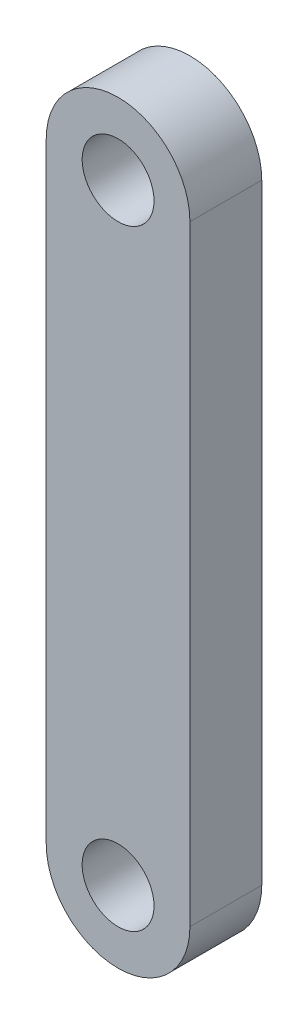
ISO-10303-21;
HEADER;
FILE_DESCRIPTION(('STEP AP214'),'2;1');
FILE_NAME('part.step','',(''),(''),'','','');
FILE_SCHEMA(('AUTOMOTIVE_DESIGN { 1 0 10303 214 1 1 1 1 }'));
ENDSEC;
DATA;
#1=APPLICATION_CONTEXT('core data for automotive mechanical design processes');
#2=APPLICATION_PROTOCOL_DEFINITION('international standard','automotive_design',2000,#1);
#3=PRODUCT_CONTEXT('',#1,'mechanical');
#4=PRODUCT('Part','Part','',(#3));
#5=PRODUCT_RELATED_PRODUCT_CATEGORY('part','',(#4));
#6=PRODUCT_DEFINITION_FORMATION('','',#4);
#7=PRODUCT_DEFINITION_CONTEXT('part definition',#1,'design');
#8=PRODUCT_DEFINITION('design','',#6,#7);
#9=PRODUCT_DEFINITION_SHAPE('','',#8);
#10=(LENGTH_UNIT() NAMED_UNIT(*) SI_UNIT(.MILLI.,.METRE.));
#11=(NAMED_UNIT(*) PLANE_ANGLE_UNIT() SI_UNIT($,.RADIAN.));
#12=(NAMED_UNIT(*) SI_UNIT($,.STERADIAN.) SOLID_ANGLE_UNIT());
#13=UNCERTAINTY_MEASURE_WITH_UNIT(LENGTH_MEASURE(1.E-05),#10,'distance_accuracy_value','');
#14=(GEOMETRIC_REPRESENTATION_CONTEXT(3) GLOBAL_UNCERTAINTY_ASSIGNED_CONTEXT((#13)) GLOBAL_UNIT_ASSIGNED_CONTEXT((#10,
#11,#12)) REPRESENTATION_CONTEXT('',''));
#15=CARTESIAN_POINT('',(0.,0.,0.));
#16=DIRECTION('',(0.,0.,1.));
#17=DIRECTION('',(1.,0.,0.));
#18=AXIS2_PLACEMENT_3D('',#15,#16,#17);
#19=CARTESIAN_POINT('',(2.,0.,2.));
#20=DIRECTION('',(0.,0.,1.));
#21=DIRECTION('',(1.,0.,0.));
#22=AXIS2_PLACEMENT_3D('',#19,#20,#21);
#23=PLANE('',#22);
#24=CARTESIAN_POINT('',(2.,0.,2.));
#25=DIRECTION('',(0.,0.,1.));
#26=DIRECTION('',(1.,0.,0.));
#27=AXIS2_PLACEMENT_3D('',#24,#25,#26);
#28=CIRCLE('',#27,1.);
#29=CARTESIAN_POINT('',(3.,0.,2.));
#30=VERTEX_POINT('',#29);
#31=EDGE_CURVE('E118',#30,#30,#28,.T.);
#32=ORIENTED_EDGE('',*,*,#31,.F.);
#33=EDGE_LOOP('',(#32));
#34=FACE_BOUND('',#33,.T.);
#35=CARTESIAN_POINT('',(2.,0.,2.));
#36=DIRECTION('',(0.,0.,1.));
#37=DIRECTION('',(1.,0.,0.));
#38=AXIS2_PLACEMENT_3D('',#35,#36,#37);
#39=CIRCLE('',#38,2.);
#40=CARTESIAN_POINT('',(4.,0.,2.));
#41=VERTEX_POINT('',#40);
#42=CARTESIAN_POINT('',(0.,0.,2.));
#43=VERTEX_POINT('',#42);
#44=EDGE_CURVE('E98',#41,#43,#39,.T.);
#45=ORIENTED_EDGE('',*,*,#44,.T.);
#46=DIRECTION('',(0.,-1.,0.));
#47=VECTOR('',#46,1.);
#48=CARTESIAN_POINT('',(0.,0.,2.));
#49=LINE('',#48,#47);
#50=CARTESIAN_POINT('',(0.,-17.,2.));
#51=VERTEX_POINT('',#50);
#52=EDGE_CURVE('E93',#43,#51,#49,.T.);
#53=ORIENTED_EDGE('',*,*,#52,.T.);
#54=CARTESIAN_POINT('',(2.,-17.,2.));
#55=DIRECTION('',(0.,0.,1.));
#56=DIRECTION('',(1.,0.,0.));
#57=AXIS2_PLACEMENT_3D('',#54,#55,#56);
#58=CIRCLE('',#57,2.);
#59=CARTESIAN_POINT('',(4.,-17.,2.));
#60=VERTEX_POINT('',#59);
#61=EDGE_CURVE('E96',#51,#60,#58,.T.);
#62=ORIENTED_EDGE('',*,*,#61,.T.);
#63=DIRECTION('',(0.,1.,0.));
#64=VECTOR('',#63,1.);
#65=CARTESIAN_POINT('',(4.,0.,2.));
#66=LINE('',#65,#64);
#67=EDGE_CURVE('E63',#60,#41,#66,.T.);
#68=ORIENTED_EDGE('',*,*,#67,.T.);
#69=EDGE_LOOP('',(#45,#53,#62,#68));
#70=FACE_BOUND('',#69,.T.);
#71=CARTESIAN_POINT('',(2.,-17.,2.));
#72=DIRECTION('',(0.,0.,1.));
#73=DIRECTION('',(1.,0.,0.));
#74=AXIS2_PLACEMENT_3D('',#71,#72,#73);
#75=CIRCLE('',#74,1.);
#76=CARTESIAN_POINT('',(3.,-17.,2.));
#77=VERTEX_POINT('',#76);
#78=EDGE_CURVE('E140',#77,#77,#75,.T.);
#79=ORIENTED_EDGE('',*,*,#78,.F.);
#80=EDGE_LOOP('',(#79));
#81=FACE_BOUND('',#80,.T.);
#82=ADVANCED_FACE('F45',(#34,#70,#81),#23,.T.);
#83=CARTESIAN_POINT('',(2.,0.,0.));
#84=DIRECTION('',(0.,0.,1.));
#85=DIRECTION('',(1.,0.,0.));
#86=AXIS2_PLACEMENT_3D('',#83,#84,#85);
#87=PLANE('',#86);
#88=CARTESIAN_POINT('',(2.,0.,0.));
#89=DIRECTION('',(0.,0.,1.));
#90=DIRECTION('',(1.,0.,0.));
#91=AXIS2_PLACEMENT_3D('',#88,#89,#90);
#92=CIRCLE('',#91,2.);
#93=CARTESIAN_POINT('',(4.,0.,0.));
#94=VERTEX_POINT('',#93);
#95=CARTESIAN_POINT('',(0.,0.,0.));
#96=VERTEX_POINT('',#95);
#97=EDGE_CURVE('E114',#94,#96,#92,.T.);
#98=ORIENTED_EDGE('',*,*,#97,.F.);
#99=DIRECTION('',(0.,1.,0.));
#100=VECTOR('',#99,1.);
#101=CARTESIAN_POINT('',(4.,0.,0.));
#102=LINE('',#101,#100);
#103=CARTESIAN_POINT('',(4.,-17.,0.));
#104=VERTEX_POINT('',#103);
#105=EDGE_CURVE('E86',#104,#94,#102,.T.);
#106=ORIENTED_EDGE('',*,*,#105,.F.);
#107=CARTESIAN_POINT('',(2.,-17.,0.));
#108=DIRECTION('',(0.,0.,1.));
#109=DIRECTION('',(1.,0.,0.));
#110=AXIS2_PLACEMENT_3D('',#107,#108,#109);
#111=CIRCLE('',#110,2.);
#112=CARTESIAN_POINT('',(0.,-17.,0.));
#113=VERTEX_POINT('',#112);
#114=EDGE_CURVE('E80',#113,#104,#111,.T.);
#115=ORIENTED_EDGE('',*,*,#114,.F.);
#116=DIRECTION('',(0.,-1.,0.));
#117=VECTOR('',#116,1.);
#118=CARTESIAN_POINT('',(0.,0.,0.));
#119=LINE('',#118,#117);
#120=EDGE_CURVE('E103',#96,#113,#119,.T.);
#121=ORIENTED_EDGE('',*,*,#120,.F.);
#122=EDGE_LOOP('',(#98,#106,#115,#121));
#123=FACE_BOUND('',#122,.T.);
#124=CARTESIAN_POINT('',(2.,0.,0.));
#125=DIRECTION('',(0.,0.,1.));
#126=DIRECTION('',(1.,0.,0.));
#127=AXIS2_PLACEMENT_3D('',#124,#125,#126);
#128=CIRCLE('',#127,1.);
#129=CARTESIAN_POINT('',(3.,0.,0.));
#130=VERTEX_POINT('',#129);
#131=EDGE_CURVE('E136',#130,#130,#128,.T.);
#132=ORIENTED_EDGE('',*,*,#131,.T.);
#133=EDGE_LOOP('',(#132));
#134=FACE_BOUND('',#133,.T.);
#135=CARTESIAN_POINT('',(2.,-17.,0.));
#136=DIRECTION('',(0.,0.,1.));
#137=DIRECTION('',(1.,0.,0.));
#138=AXIS2_PLACEMENT_3D('',#135,#136,#137);
#139=CIRCLE('',#138,1.);
#140=CARTESIAN_POINT('',(3.,-17.,0.));
#141=VERTEX_POINT('',#140);
#142=EDGE_CURVE('E144',#141,#141,#139,.T.);
#143=ORIENTED_EDGE('',*,*,#142,.T.);
#144=EDGE_LOOP('',(#143));
#145=FACE_BOUND('',#144,.T.);
#146=ADVANCED_FACE('F131',(#123,#134,#145),#87,.F.);
#147=CARTESIAN_POINT('',(2.,0.,2.));
#148=DIRECTION('',(0.,0.,-1.));
#149=DIRECTION('',(-1.,0.,0.));
#150=AXIS2_PLACEMENT_3D('',#147,#148,#149);
#151=CYLINDRICAL_SURFACE('',#150,2.);
#152=ORIENTED_EDGE('',*,*,#97,.T.);
#153=DIRECTION('',(0.,0.,-1.));
#154=VECTOR('',#153,1.);
#155=CARTESIAN_POINT('',(0.,0.,2.));
#156=LINE('',#155,#154);
#157=EDGE_CURVE('E11',#43,#96,#156,.T.);
#158=ORIENTED_EDGE('',*,*,#157,.F.);
#159=ORIENTED_EDGE('',*,*,#44,.F.);
#160=DIRECTION('',(0.,0.,-1.));
#161=VECTOR('',#160,1.);
#162=CARTESIAN_POINT('',(4.,0.,2.));
#163=LINE('',#162,#161);
#164=EDGE_CURVE('E110',#41,#94,#163,.T.);
#165=ORIENTED_EDGE('',*,*,#164,.T.);
#166=EDGE_LOOP('',(#152,#158,#159,#165));
#167=FACE_BOUND('',#166,.T.);
#168=ADVANCED_FACE('F47',(#167),#151,.T.);
#169=CARTESIAN_POINT('',(0.,0.,2.));
#170=DIRECTION('',(1.,0.,0.));
#171=DIRECTION('',(0.,1.,0.));
#172=AXIS2_PLACEMENT_3D('',#169,#170,#171);
#173=PLANE('',#172);
#174=ORIENTED_EDGE('',*,*,#120,.T.);
#175=DIRECTION('',(0.,0.,-1.));
#176=VECTOR('',#175,1.);
#177=CARTESIAN_POINT('',(0.,-17.,2.));
#178=LINE('',#177,#176);
#179=EDGE_CURVE('E55',#51,#113,#178,.T.);
#180=ORIENTED_EDGE('',*,*,#179,.F.);
#181=ORIENTED_EDGE('',*,*,#52,.F.);
#182=ORIENTED_EDGE('',*,*,#157,.T.);
#183=EDGE_LOOP('',(#174,#180,#181,#182));
#184=FACE_BOUND('',#183,.T.);
#185=ADVANCED_FACE('F102',(#184),#173,.F.);
#186=CARTESIAN_POINT('',(2.,-17.,2.));
#187=DIRECTION('',(0.,0.,-1.));
#188=DIRECTION('',(-1.,0.,0.));
#189=AXIS2_PLACEMENT_3D('',#186,#187,#188);
#190=CYLINDRICAL_SURFACE('',#189,2.);
#191=ORIENTED_EDGE('',*,*,#114,.T.);
#192=DIRECTION('',(0.,0.,-1.));
#193=VECTOR('',#192,1.);
#194=CARTESIAN_POINT('',(4.,-17.,2.));
#195=LINE('',#194,#193);
#196=EDGE_CURVE('E105',#60,#104,#195,.T.);
#197=ORIENTED_EDGE('',*,*,#196,.F.);
#198=ORIENTED_EDGE('',*,*,#61,.F.);
#199=ORIENTED_EDGE('',*,*,#179,.T.);
#200=EDGE_LOOP('',(#191,#197,#198,#199));
#201=FACE_BOUND('',#200,.T.);
#202=ADVANCED_FACE('F106',(#201),#190,.T.);
#203=CARTESIAN_POINT('',(4.,0.,2.));
#204=DIRECTION('',(-1.,0.,0.));
#205=DIRECTION('',(0.,-1.,0.));
#206=AXIS2_PLACEMENT_3D('',#203,#204,#205);
#207=PLANE('',#206);
#208=ORIENTED_EDGE('',*,*,#105,.T.);
#209=ORIENTED_EDGE('',*,*,#164,.F.);
#210=ORIENTED_EDGE('',*,*,#67,.F.);
#211=ORIENTED_EDGE('',*,*,#196,.T.);
#212=EDGE_LOOP('',(#208,#209,#210,#211));
#213=FACE_BOUND('',#212,.T.);
#214=ADVANCED_FACE('F128',(#213),#207,.F.);
#215=CARTESIAN_POINT('',(2.,0.,2.));
#216=DIRECTION('',(0.,0.,-1.));
#217=DIRECTION('',(-1.,0.,0.));
#218=AXIS2_PLACEMENT_3D('',#215,#216,#217);
#219=CYLINDRICAL_SURFACE('',#218,1.);
#220=ORIENTED_EDGE('',*,*,#31,.T.);
#221=EDGE_LOOP('',(#220));
#222=FACE_BOUND('',#221,.T.);
#223=ORIENTED_EDGE('',*,*,#131,.F.);
#224=EDGE_LOOP('',(#223));
#225=FACE_BOUND('',#224,.T.);
#226=ADVANCED_FACE('F163',(#222,#225),#219,.F.);
#227=CARTESIAN_POINT('',(2.,-17.,2.));
#228=DIRECTION('',(0.,0.,-1.));
#229=DIRECTION('',(-1.,0.,0.));
#230=AXIS2_PLACEMENT_3D('',#227,#228,#229);
#231=CYLINDRICAL_SURFACE('',#230,1.);
#232=ORIENTED_EDGE('',*,*,#78,.T.);
#233=EDGE_LOOP('',(#232));
#234=FACE_BOUND('',#233,.T.);
#235=ORIENTED_EDGE('',*,*,#142,.F.);
#236=EDGE_LOOP('',(#235));
#237=FACE_BOUND('',#236,.T.);
#238=ADVANCED_FACE('F152',(#234,#237),#231,.F.);
#239=CLOSED_SHELL('',(#82,#146,#168,#185,#202,#214,#226,#238));
#240=MANIFOLD_SOLID_BREP('B2',#239);
#241=ADVANCED_BREP_SHAPE_REPRESENTATION('',(#18,#240),#14);
#242=SHAPE_DEFINITION_REPRESENTATION(#9,#241);
ENDSEC;
END-ISO-10303-21;
